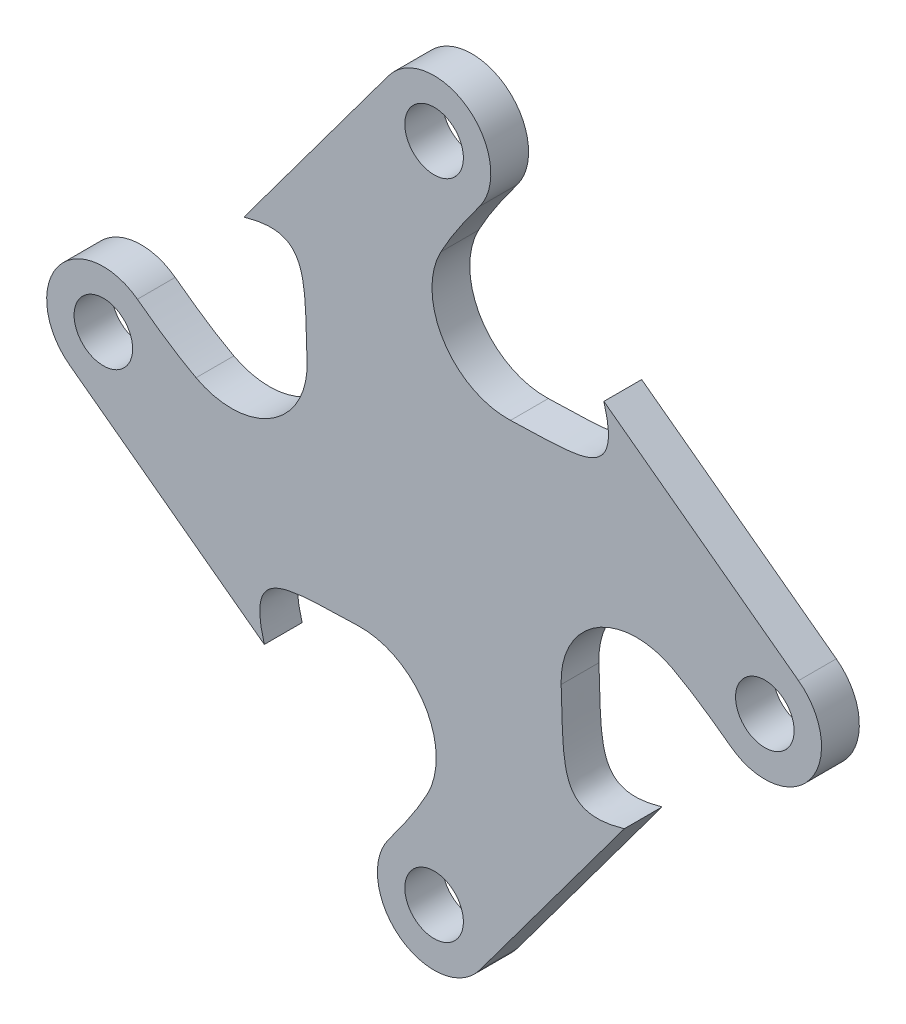
ISO-10303-21;
HEADER;
FILE_DESCRIPTION(('STEP AP214'),'2;1');
FILE_NAME('part.step','',(''),(''),'','','');
FILE_SCHEMA(('AUTOMOTIVE_DESIGN { 1 0 10303 214 1 1 1 1 }'));
ENDSEC;
DATA;
#1=APPLICATION_CONTEXT('core data for automotive mechanical design processes');
#2=APPLICATION_PROTOCOL_DEFINITION('international standard','automotive_design',2000,#1);
#3=PRODUCT_CONTEXT('',#1,'mechanical');
#4=PRODUCT('Part','Part','',(#3));
#5=PRODUCT_RELATED_PRODUCT_CATEGORY('part','',(#4));
#6=PRODUCT_DEFINITION_FORMATION('','',#4);
#7=PRODUCT_DEFINITION_CONTEXT('part definition',#1,'design');
#8=PRODUCT_DEFINITION('design','',#6,#7);
#9=PRODUCT_DEFINITION_SHAPE('','',#8);
#10=(LENGTH_UNIT() NAMED_UNIT(*) SI_UNIT(.MILLI.,.METRE.));
#11=(NAMED_UNIT(*) PLANE_ANGLE_UNIT() SI_UNIT($,.RADIAN.));
#12=(NAMED_UNIT(*) SI_UNIT($,.STERADIAN.) SOLID_ANGLE_UNIT());
#13=UNCERTAINTY_MEASURE_WITH_UNIT(LENGTH_MEASURE(1.E-05),#10,'distance_accuracy_value','');
#14=(GEOMETRIC_REPRESENTATION_CONTEXT(3) GLOBAL_UNCERTAINTY_ASSIGNED_CONTEXT((#13)) GLOBAL_UNIT_ASSIGNED_CONTEXT((#10,
#11,#12)) REPRESENTATION_CONTEXT('',''));
#15=CARTESIAN_POINT('',(0.,0.,0.));
#16=DIRECTION('',(0.,0.,1.));
#17=DIRECTION('',(1.,0.,0.));
#18=AXIS2_PLACEMENT_3D('',#15,#16,#17);
#19=CARTESIAN_POINT('',(-10.062410419015,8.98360382236813,2.));
#20=CARTESIAN_POINT('',(-4.76049822060656,10.5187773188604,2.));
#21=CARTESIAN_POINT('',(-8.17600939884948,4.4707680019017,2.));
#22=CARTESIAN_POINT('',(-5.59212995310449,-2.17441545882833,2.));
#23=B_SPLINE_CURVE_WITH_KNOTS('',3,(#19,#20,#21,#22),.UNSPECIFIED.,.F.,.F.,(4,4),(0.,1.),.UNSPECIFIED.);
#24=DIRECTION('',(0.,0.,-1.));
#25=VECTOR('',#24,1.);
#26=SURFACE_OF_LINEAR_EXTRUSION('',#23,#25);
#27=CARTESIAN_POINT('',(-10.062410419015,8.98360382236813,0.));
#28=CARTESIAN_POINT('',(-4.76049822060656,10.5187773188604,0.));
#29=CARTESIAN_POINT('',(-8.17600939884948,4.4707680019017,0.));
#30=CARTESIAN_POINT('',(-5.59212995310449,-2.17441545882833,0.));
#31=B_SPLINE_CURVE_WITH_KNOTS('',3,(#27,#28,#29,#30),.UNSPECIFIED.,.F.,.F.,(4,4),(0.,1.),.UNSPECIFIED.);
#32=CARTESIAN_POINT('',(-10.062410419015,8.98360382236813,0.));
#33=VERTEX_POINT('',#32);
#34=CARTESIAN_POINT('',(-6.72254395219128,4.04475251777847,0.));
#35=VERTEX_POINT('',#34);
#36=EDGE_CURVE('E392',#33,#35,#31,.T.);
#37=ORIENTED_EDGE('',*,*,#36,.T.);
#38=DIRECTION('',(0.,0.,-1.));
#39=VECTOR('',#38,1.);
#40=CARTESIAN_POINT('',(-6.72254395219186,4.04475251779317,0.));
#41=LINE('',#40,#39);
#42=CARTESIAN_POINT('',(-6.72254395219128,4.04475251777847,2.));
#43=VERTEX_POINT('',#42);
#44=EDGE_CURVE('E372',#35,#43,#41,.F.);
#45=ORIENTED_EDGE('',*,*,#44,.T.);
#46=CARTESIAN_POINT('',(-10.062410419015,8.98360382236813,2.));
#47=VERTEX_POINT('',#46);
#48=EDGE_CURVE('E301',#47,#43,#23,.T.);
#49=ORIENTED_EDGE('',*,*,#48,.F.);
#50=DIRECTION('',(0.,0.,-1.));
#51=VECTOR('',#50,1.);
#52=CARTESIAN_POINT('',(-10.062410419015,8.98360382236813,2.));
#53=LINE('',#52,#51);
#54=EDGE_CURVE('E377',#47,#33,#53,.T.);
#55=ORIENTED_EDGE('',*,*,#54,.T.);
#56=EDGE_LOOP('',(#37,#45,#49,#55));
#57=FACE_BOUND('',#56,.T.);
#58=ADVANCED_FACE('F35',(#57),#26,.F.);
#59=CARTESIAN_POINT('',(4.25702429147716,4.22820815260713,2.));
#60=CARTESIAN_POINT('',(0.108817481629295,8.40468587513948,2.));
#61=CARTESIAN_POINT('',(-2.96426942676939,8.54641605176527,2.));
#62=CARTESIAN_POINT('',(2.40014791806406,15.7001972409698,2.));
#63=B_SPLINE_CURVE_WITH_KNOTS('',3,(#59,#60,#61,#62),.UNSPECIFIED.,.F.,.F.,(4,4),(0.,1.),.UNSPECIFIED.);
#64=DIRECTION('',(0.,0.,-1.));
#65=VECTOR('',#64,1.);
#66=SURFACE_OF_LINEAR_EXTRUSION('',#63,#65);
#67=CARTESIAN_POINT('',(0.354438378044691,12.5956281870455,2.));
#68=VERTEX_POINT('',#67);
#69=CARTESIAN_POINT('',(2.40014791806406,15.7001972409698,2.));
#70=VERTEX_POINT('',#69);
#71=EDGE_CURVE('E307',#68,#70,#63,.T.);
#72=ORIENTED_EDGE('',*,*,#71,.F.);
#73=DIRECTION('',(0.,0.,-1.));
#74=VECTOR('',#73,1.);
#75=CARTESIAN_POINT('',(0.354438378043567,12.5956281870434,2.));
#76=LINE('',#75,#74);
#77=CARTESIAN_POINT('',(0.354438378044691,12.5956281870455,0.));
#78=VERTEX_POINT('',#77);
#79=EDGE_CURVE('E56',#68,#78,#76,.T.);
#80=ORIENTED_EDGE('',*,*,#79,.T.);
#81=CARTESIAN_POINT('',(4.25702429147716,4.22820815260713,0.));
#82=CARTESIAN_POINT('',(0.108817481629295,8.40468587513948,0.));
#83=CARTESIAN_POINT('',(-2.96426942676939,8.54641605176527,0.));
#84=CARTESIAN_POINT('',(2.40014791806406,15.7001972409698,0.));
#85=B_SPLINE_CURVE_WITH_KNOTS('',3,(#81,#82,#83,#84),.UNSPECIFIED.,.F.,.F.,(4,4),(0.,1.),.UNSPECIFIED.);
#86=CARTESIAN_POINT('',(2.40014791806406,15.7001972409698,0.));
#87=VERTEX_POINT('',#86);
#88=EDGE_CURVE('E388',#78,#87,#85,.T.);
#89=ORIENTED_EDGE('',*,*,#88,.T.);
#90=DIRECTION('',(0.,0.,-1.));
#91=VECTOR('',#90,1.);
#92=CARTESIAN_POINT('',(2.40014791806406,15.7001972409698,2.));
#93=LINE('',#92,#91);
#94=EDGE_CURVE('E380',#70,#87,#93,.T.);
#95=ORIENTED_EDGE('',*,*,#94,.F.);
#96=EDGE_LOOP('',(#72,#80,#89,#95));
#97=FACE_BOUND('',#96,.T.);
#98=ADVANCED_FACE('F319',(#97),#66,.F.);
#99=CARTESIAN_POINT('',(-10.7851413626872,8.01054160241209,2.));
#100=DIRECTION('',(0.802789371924031,-0.59626271418379,0.));
#101=DIRECTION('',(0.59626271418379,0.802789371924031,0.));
#102=AXIS2_PLACEMENT_3D('',#99,#100,#101);
#103=PLANE('',#102);
#104=DIRECTION('',(-0.59626271418379,-0.802789371924031,0.));
#105=VECTOR('',#104,1.);
#106=CARTESIAN_POINT('',(-10.7851413626872,8.01054160241209,0.));
#107=LINE('',#106,#105);
#108=CARTESIAN_POINT('',(-2.41369577454256,19.2815927446966,0.));
#109=VERTEX_POINT('',#108);
#110=EDGE_CURVE('E297',#109,#33,#107,.T.);
#111=ORIENTED_EDGE('',*,*,#110,.T.);
#112=ORIENTED_EDGE('',*,*,#54,.F.);
#113=DIRECTION('',(-0.59626271418379,-0.802789371924031,0.));
#114=VECTOR('',#113,1.);
#115=CARTESIAN_POINT('',(-10.7851413626872,8.01054160241209,2.));
#116=LINE('',#115,#114);
#117=CARTESIAN_POINT('',(-2.41369577454256,19.2815927446966,2.));
#118=VERTEX_POINT('',#117);
#119=EDGE_CURVE('E298',#118,#47,#116,.T.);
#120=ORIENTED_EDGE('',*,*,#119,.F.);
#121=DIRECTION('',(0.,0.,-1.));
#122=VECTOR('',#121,1.);
#123=CARTESIAN_POINT('',(-2.41369577454256,19.2815927446966,2.));
#124=LINE('',#123,#122);
#125=EDGE_CURVE('E383',#118,#109,#124,.T.);
#126=ORIENTED_EDGE('',*,*,#125,.T.);
#127=EDGE_LOOP('',(#111,#112,#120,#126));
#128=FACE_BOUND('',#127,.T.);
#129=ADVANCED_FACE('F322',(#128),#103,.F.);
#130=CARTESIAN_POINT('',(0.,17.5,2.));
#131=DIRECTION('',(0.,0.,-1.));
#132=DIRECTION('',(-1.,0.,0.));
#133=AXIS2_PLACEMENT_3D('',#130,#131,#132);
#134=CYLINDRICAL_SURFACE('',#133,3.);
#135=CARTESIAN_POINT('',(0.,17.5,0.));
#136=DIRECTION('',(0.,0.,1.));
#137=DIRECTION('',(1.,0.,0.));
#138=AXIS2_PLACEMENT_3D('',#135,#136,#137);
#139=CIRCLE('',#138,3.);
#140=EDGE_CURVE('E302',#87,#109,#139,.T.);
#141=ORIENTED_EDGE('',*,*,#140,.T.);
#142=ORIENTED_EDGE('',*,*,#125,.F.);
#143=CARTESIAN_POINT('',(0.,17.5,2.));
#144=DIRECTION('',(0.,0.,1.));
#145=DIRECTION('',(1.,0.,0.));
#146=AXIS2_PLACEMENT_3D('',#143,#144,#145);
#147=CIRCLE('',#146,3.);
#148=EDGE_CURVE('E386',#70,#118,#147,.T.);
#149=ORIENTED_EDGE('',*,*,#148,.F.);
#150=ORIENTED_EDGE('',*,*,#94,.T.);
#151=EDGE_LOOP('',(#141,#142,#149,#150));
#152=FACE_BOUND('',#151,.T.);
#153=ADVANCED_FACE('F325',(#152),#134,.T.);
#154=CARTESIAN_POINT('',(0.,0.,2.));
#155=DIRECTION('',(0.,0.,1.));
#156=DIRECTION('',(1.,0.,0.));
#157=AXIS2_PLACEMENT_3D('',#154,#155,#156);
#158=PLANE('',#157);
#159=CARTESIAN_POINT('',(-17.5,0.,2.));
#160=DIRECTION('',(0.,0.,1.));
#161=DIRECTION('',(1.,0.,0.));
#162=AXIS2_PLACEMENT_3D('',#159,#160,#161);
#163=CIRCLE('',#162,1.55);
#164=CARTESIAN_POINT('',(-15.95,0.,2.));
#165=VERTEX_POINT('',#164);
#166=EDGE_CURVE('E601',#165,#165,#163,.T.);
#167=ORIENTED_EDGE('',*,*,#166,.F.);
#168=EDGE_LOOP('',(#167));
#169=FACE_BOUND('',#168,.T.);
#170=CARTESIAN_POINT('',(0.,-17.5,2.));
#171=DIRECTION('',(0.,0.,1.));
#172=DIRECTION('',(1.,0.,0.));
#173=AXIS2_PLACEMENT_3D('',#170,#171,#172);
#174=CIRCLE('',#173,1.55);
#175=CARTESIAN_POINT('',(1.55,-17.5,2.));
#176=VERTEX_POINT('',#175);
#177=EDGE_CURVE('E603',#176,#176,#174,.T.);
#178=ORIENTED_EDGE('',*,*,#177,.F.);
#179=EDGE_LOOP('',(#178));
#180=FACE_BOUND('',#179,.T.);
#181=CARTESIAN_POINT('',(17.5,1.83302770289264E-13,2.));
#182=DIRECTION('',(0.,0.,1.));
#183=DIRECTION('',(1.,0.,0.));
#184=AXIS2_PLACEMENT_3D('',#181,#182,#183);
#185=CIRCLE('',#184,1.55);
#186=CARTESIAN_POINT('',(19.05,1.83302770289264E-13,2.));
#187=VERTEX_POINT('',#186);
#188=EDGE_CURVE('E609',#187,#187,#185,.T.);
#189=ORIENTED_EDGE('',*,*,#188,.F.);
#190=EDGE_LOOP('',(#189));
#191=FACE_BOUND('',#190,.T.);
#192=CARTESIAN_POINT('',(0.,17.5,2.));
#193=DIRECTION('',(0.,0.,1.));
#194=DIRECTION('',(1.,0.,0.));
#195=AXIS2_PLACEMENT_3D('',#192,#193,#194);
#196=CIRCLE('',#195,1.55);
#197=CARTESIAN_POINT('',(1.55,17.5,2.));
#198=VERTEX_POINT('',#197);
#199=EDGE_CURVE('E615',#198,#198,#196,.T.);
#200=ORIENTED_EDGE('',*,*,#199,.F.);
#201=EDGE_LOOP('',(#200));
#202=FACE_BOUND('',#201,.T.);
#203=ORIENTED_EDGE('',*,*,#48,.T.);
#204=CARTESIAN_POINT('',(-10.7194371215907,3.88712957398968,2.));
#205=DIRECTION('',(0.,0.,1.));
#206=DIRECTION('',(1.,0.,0.));
#207=AXIS2_PLACEMENT_3D('',#204,#205,#206);
#208=CIRCLE('',#207,4.);
#209=CARTESIAN_POINT('',(-12.595628187045,0.354438378044396,2.));
#210=VERTEX_POINT('',#209);
#211=EDGE_CURVE('E359',#43,#210,#208,.F.);
#212=ORIENTED_EDGE('',*,*,#211,.T.);
#213=CARTESIAN_POINT('',(-4.22820815260714,4.25702429147714,2.));
#214=CARTESIAN_POINT('',(-8.40468587513948,0.108817481629266,2.));
#215=CARTESIAN_POINT('',(-8.54641605176526,-2.96426942676942,2.));
#216=CARTESIAN_POINT('',(-15.7001972409698,2.40014791806401,2.));
#217=B_SPLINE_CURVE_WITH_KNOTS('',3,(#213,#214,#215,#216),.UNSPECIFIED.,.F.,.F.,(4,4),(0.,1.),.UNSPECIFIED.);
#218=CARTESIAN_POINT('',(-15.7001972409698,2.40014791806401,2.));
#219=VERTEX_POINT('',#218);
#220=EDGE_CURVE('E251',#210,#219,#217,.T.);
#221=ORIENTED_EDGE('',*,*,#220,.T.);
#222=CARTESIAN_POINT('',(-17.5,0.,2.));
#223=DIRECTION('',(0.,0.,1.));
#224=DIRECTION('',(0.,1.,0.));
#225=AXIS2_PLACEMENT_3D('',#222,#223,#224);
#226=CIRCLE('',#225,3.);
#227=CARTESIAN_POINT('',(-19.2815927446965,-2.41369577454262,2.));
#228=VERTEX_POINT('',#227);
#229=EDGE_CURVE('E256',#219,#228,#226,.T.);
#230=ORIENTED_EDGE('',*,*,#229,.T.);
#231=DIRECTION('',(0.802789371924033,-0.596262714183787,0.));
#232=VECTOR('',#231,1.);
#233=CARTESIAN_POINT('',(-8.01054160241205,-10.7851413626872,2.));
#234=LINE('',#233,#232);
#235=CARTESIAN_POINT('',(-8.98360382236809,-10.062410419015,2.));
#236=VERTEX_POINT('',#235);
#237=EDGE_CURVE('E288',#228,#236,#234,.T.);
#238=ORIENTED_EDGE('',*,*,#237,.T.);
#239=CARTESIAN_POINT('',(-8.98360382236809,-10.062410419015,2.));
#240=CARTESIAN_POINT('',(-10.5187773188604,-4.76049822060659,2.));
#241=CARTESIAN_POINT('',(-4.47076800190167,-8.1760093988495,2.));
#242=CARTESIAN_POINT('',(2.17441545882835,-5.59212995310448,2.));
#243=B_SPLINE_CURVE_WITH_KNOTS('',3,(#239,#240,#241,#242),.UNSPECIFIED.,.F.,.F.,(4,4),(0.,1.),.UNSPECIFIED.);
#244=CARTESIAN_POINT('',(-4.04475251777852,-6.7225439521913,2.));
#245=VERTEX_POINT('',#244);
#246=EDGE_CURVE('E257',#236,#245,#243,.T.);
#247=ORIENTED_EDGE('',*,*,#246,.T.);
#248=CARTESIAN_POINT('',(-3.88712957398973,-10.7194371215907,2.));
#249=DIRECTION('',(0.,0.,1.));
#250=DIRECTION('',(1.,0.,0.));
#251=AXIS2_PLACEMENT_3D('',#248,#249,#250);
#252=CIRCLE('',#251,4.);
#253=CARTESIAN_POINT('',(-0.354438378044873,-12.5956281870458,2.));
#254=VERTEX_POINT('',#253);
#255=EDGE_CURVE('E353',#245,#254,#252,.F.);
#256=ORIENTED_EDGE('',*,*,#255,.T.);
#257=CARTESIAN_POINT('',(-4.25702429147716,-4.22820815260713,2.));
#258=CARTESIAN_POINT('',(-0.108817481629295,-8.40468587513948,2.));
#259=CARTESIAN_POINT('',(2.96426942676939,-8.54641605176527,2.));
#260=CARTESIAN_POINT('',(-2.40014791806406,-15.7001972409698,2.));
#261=B_SPLINE_CURVE_WITH_KNOTS('',3,(#257,#258,#259,#260),.UNSPECIFIED.,.F.,.F.,(4,4),(0.,1.),.UNSPECIFIED.);
#262=CARTESIAN_POINT('',(-2.40014791806406,-15.7001972409698,2.));
#263=VERTEX_POINT('',#262);
#264=EDGE_CURVE('E216',#254,#263,#261,.T.);
#265=ORIENTED_EDGE('',*,*,#264,.T.);
#266=CARTESIAN_POINT('',(0.,-17.5,2.));
#267=DIRECTION('',(0.,0.,1.));
#268=DIRECTION('',(-1.,0.,0.));
#269=AXIS2_PLACEMENT_3D('',#266,#267,#268);
#270=CIRCLE('',#269,3.);
#271=CARTESIAN_POINT('',(2.41369577454256,-19.2815927446966,2.));
#272=VERTEX_POINT('',#271);
#273=EDGE_CURVE('E437',#263,#272,#270,.T.);
#274=ORIENTED_EDGE('',*,*,#273,.T.);
#275=DIRECTION('',(0.59626271418379,0.802789371924031,0.));
#276=VECTOR('',#275,1.);
#277=CARTESIAN_POINT('',(10.7851413626872,-8.01054160241209,2.));
#278=LINE('',#277,#276);
#279=CARTESIAN_POINT('',(10.062410419015,-8.98360382236813,2.));
#280=VERTEX_POINT('',#279);
#281=EDGE_CURVE('E206',#272,#280,#278,.T.);
#282=ORIENTED_EDGE('',*,*,#281,.T.);
#283=CARTESIAN_POINT('',(10.062410419015,-8.98360382236813,2.));
#284=CARTESIAN_POINT('',(4.76049822060656,-10.5187773188604,2.));
#285=CARTESIAN_POINT('',(8.17600939884948,-4.4707680019017,2.));
#286=CARTESIAN_POINT('',(5.59212995310449,2.17441545882833,2.));
#287=B_SPLINE_CURVE_WITH_KNOTS('',3,(#283,#284,#285,#286),.UNSPECIFIED.,.F.,.F.,(4,4),(0.,1.),.UNSPECIFIED.);
#288=CARTESIAN_POINT('',(6.72254395219128,-4.04475251777838,2.));
#289=VERTEX_POINT('',#288);
#290=EDGE_CURVE('E209',#280,#289,#287,.T.);
#291=ORIENTED_EDGE('',*,*,#290,.T.);
#292=CARTESIAN_POINT('',(10.7194371215906,-3.88712957398958,2.));
#293=DIRECTION('',(0.,0.,1.));
#294=DIRECTION('',(1.,0.,0.));
#295=AXIS2_PLACEMENT_3D('',#292,#293,#294);
#296=CIRCLE('',#295,4.);
#297=CARTESIAN_POINT('',(12.595628187045,-0.354438378044284,2.));
#298=VERTEX_POINT('',#297);
#299=EDGE_CURVE('E346',#289,#298,#296,.F.);
#300=ORIENTED_EDGE('',*,*,#299,.T.);
#301=CARTESIAN_POINT('',(4.22820815260717,-4.25702429147711,2.));
#302=CARTESIAN_POINT('',(8.40468587513948,-0.108817481629207,2.));
#303=CARTESIAN_POINT('',(8.54641605176524,2.96426942676948,2.));
#304=CARTESIAN_POINT('',(15.7001972409698,-2.4001479180639,2.));
#305=B_SPLINE_CURVE_WITH_KNOTS('',3,(#301,#302,#303,#304),.UNSPECIFIED.,.F.,.F.,(4,4),(0.,1.),.UNSPECIFIED.);
#306=CARTESIAN_POINT('',(15.7001972409698,-2.4001479180639,2.));
#307=VERTEX_POINT('',#306);
#308=EDGE_CURVE('E179',#298,#307,#305,.T.);
#309=ORIENTED_EDGE('',*,*,#308,.T.);
#310=CARTESIAN_POINT('',(17.5,1.83302770289264E-13,2.));
#311=DIRECTION('',(0.,0.,1.));
#312=DIRECTION('',(0.,-1.,0.));
#313=AXIS2_PLACEMENT_3D('',#310,#311,#312);
#314=CIRCLE('',#313,3.);
#315=CARTESIAN_POINT('',(19.2815927446965,2.41369577454276,2.));
#316=VERTEX_POINT('',#315);
#317=EDGE_CURVE('E186',#307,#316,#314,.T.);
#318=ORIENTED_EDGE('',*,*,#317,.T.);
#319=DIRECTION('',(-0.802789371924038,0.596262714183781,0.));
#320=VECTOR('',#319,1.);
#321=CARTESIAN_POINT('',(8.01054160241197,10.7851413626873,2.));
#322=LINE('',#321,#320);
#323=CARTESIAN_POINT('',(8.98360382236802,10.0624104190151,2.));
#324=VERTEX_POINT('',#323);
#325=EDGE_CURVE('E180',#316,#324,#322,.T.);
#326=ORIENTED_EDGE('',*,*,#325,.T.);
#327=CARTESIAN_POINT('',(8.98360382236802,10.0624104190151,2.));
#328=CARTESIAN_POINT('',(10.5187773188603,4.76049822060667,2.));
#329=CARTESIAN_POINT('',(4.47076800190161,8.17600939884953,2.));
#330=CARTESIAN_POINT('',(-2.17441545882839,5.59212995310446,2.));
#331=B_SPLINE_CURVE_WITH_KNOTS('',3,(#327,#328,#329,#330),.UNSPECIFIED.,.F.,.F.,(4,4),(0.,1.),.UNSPECIFIED.);
#332=CARTESIAN_POINT('',(4.04475251777856,6.72254395219133,2.));
#333=VERTEX_POINT('',#332);
#334=EDGE_CURVE('E170',#324,#333,#331,.T.);
#335=ORIENTED_EDGE('',*,*,#334,.T.);
#336=CARTESIAN_POINT('',(3.88712957398974,10.7194371215907,2.));
#337=DIRECTION('',(0.,0.,1.));
#338=DIRECTION('',(1.,0.,0.));
#339=AXIS2_PLACEMENT_3D('',#336,#337,#338);
#340=CIRCLE('',#339,4.);
#341=EDGE_CURVE('E43',#333,#68,#340,.F.);
#342=ORIENTED_EDGE('',*,*,#341,.T.);
#343=ORIENTED_EDGE('',*,*,#71,.T.);
#344=ORIENTED_EDGE('',*,*,#148,.T.);
#345=ORIENTED_EDGE('',*,*,#119,.T.);
#346=EDGE_LOOP('',(#203,#212,#221,#230,#238,#247,#256,#265,#274,#282,#291,#300,#309,#318,#326,
#335,#342,#343,#344,#345));
#347=FACE_BOUND('',#346,.T.);
#348=ADVANCED_FACE('F184',(#169,#180,#191,#202,#347),#158,.T.);
#349=CARTESIAN_POINT('',(0.,0.,0.));
#350=DIRECTION('',(0.,0.,1.));
#351=DIRECTION('',(1.,0.,0.));
#352=AXIS2_PLACEMENT_3D('',#349,#350,#351);
#353=PLANE('',#352);
#354=CARTESIAN_POINT('',(-17.5,0.,0.));
#355=DIRECTION('',(0.,0.,1.));
#356=DIRECTION('',(1.,0.,0.));
#357=AXIS2_PLACEMENT_3D('',#354,#355,#356);
#358=CIRCLE('',#357,1.55);
#359=CARTESIAN_POINT('',(-15.95,0.,0.));
#360=VERTEX_POINT('',#359);
#361=EDGE_CURVE('E598',#360,#360,#358,.T.);
#362=ORIENTED_EDGE('',*,*,#361,.T.);
#363=EDGE_LOOP('',(#362));
#364=FACE_BOUND('',#363,.T.);
#365=CARTESIAN_POINT('',(0.,-17.5,0.));
#366=DIRECTION('',(0.,0.,1.));
#367=DIRECTION('',(1.,0.,0.));
#368=AXIS2_PLACEMENT_3D('',#365,#366,#367);
#369=CIRCLE('',#368,1.55);
#370=CARTESIAN_POINT('',(1.55,-17.5,0.));
#371=VERTEX_POINT('',#370);
#372=EDGE_CURVE('E606',#371,#371,#369,.T.);
#373=ORIENTED_EDGE('',*,*,#372,.T.);
#374=EDGE_LOOP('',(#373));
#375=FACE_BOUND('',#374,.T.);
#376=CARTESIAN_POINT('',(17.5,1.83302770289264E-13,0.));
#377=DIRECTION('',(0.,0.,1.));
#378=DIRECTION('',(1.,0.,0.));
#379=AXIS2_PLACEMENT_3D('',#376,#377,#378);
#380=CIRCLE('',#379,1.55);
#381=CARTESIAN_POINT('',(19.05,1.83302770289264E-13,0.));
#382=VERTEX_POINT('',#381);
#383=EDGE_CURVE('E612',#382,#382,#380,.T.);
#384=ORIENTED_EDGE('',*,*,#383,.T.);
#385=EDGE_LOOP('',(#384));
#386=FACE_BOUND('',#385,.T.);
#387=CARTESIAN_POINT('',(0.,17.5,0.));
#388=DIRECTION('',(0.,0.,1.));
#389=DIRECTION('',(1.,0.,0.));
#390=AXIS2_PLACEMENT_3D('',#387,#388,#389);
#391=CIRCLE('',#390,1.55);
#392=CARTESIAN_POINT('',(1.55,17.5,0.));
#393=VERTEX_POINT('',#392);
#394=EDGE_CURVE('E618',#393,#393,#391,.T.);
#395=ORIENTED_EDGE('',*,*,#394,.T.);
#396=EDGE_LOOP('',(#395));
#397=FACE_BOUND('',#396,.T.);
#398=CARTESIAN_POINT('',(-4.22820815260714,4.25702429147714,0.));
#399=CARTESIAN_POINT('',(-8.40468587513948,0.108817481629266,0.));
#400=CARTESIAN_POINT('',(-8.54641605176526,-2.96426942676942,0.));
#401=CARTESIAN_POINT('',(-15.7001972409698,2.40014791806401,0.));
#402=B_SPLINE_CURVE_WITH_KNOTS('',3,(#398,#399,#400,#401),.UNSPECIFIED.,.F.,.F.,(4,4),(0.,1.),.UNSPECIFIED.);
#403=CARTESIAN_POINT('',(-12.595628187045,0.354438378044396,0.));
#404=VERTEX_POINT('',#403);
#405=CARTESIAN_POINT('',(-15.7001972409698,2.40014791806401,0.));
#406=VERTEX_POINT('',#405);
#407=EDGE_CURVE('E276',#404,#406,#402,.T.);
#408=ORIENTED_EDGE('',*,*,#407,.F.);
#409=CARTESIAN_POINT('',(-10.7194371215907,3.88712957398968,0.));
#410=DIRECTION('',(0.,0.,1.));
#411=DIRECTION('',(1.,0.,0.));
#412=AXIS2_PLACEMENT_3D('',#409,#410,#411);
#413=CIRCLE('',#412,4.);
#414=EDGE_CURVE('E361',#404,#35,#413,.T.);
#415=ORIENTED_EDGE('',*,*,#414,.T.);
#416=ORIENTED_EDGE('',*,*,#36,.F.);
#417=ORIENTED_EDGE('',*,*,#110,.F.);
#418=ORIENTED_EDGE('',*,*,#140,.F.);
#419=ORIENTED_EDGE('',*,*,#88,.F.);
#420=CARTESIAN_POINT('',(3.88712957398974,10.7194371215907,0.));
#421=DIRECTION('',(0.,0.,1.));
#422=DIRECTION('',(1.,0.,0.));
#423=AXIS2_PLACEMENT_3D('',#420,#421,#422);
#424=CIRCLE('',#423,4.);
#425=CARTESIAN_POINT('',(4.04475251777856,6.72254395219133,0.));
#426=VERTEX_POINT('',#425);
#427=EDGE_CURVE('E11',#78,#426,#424,.T.);
#428=ORIENTED_EDGE('',*,*,#427,.T.);
#429=CARTESIAN_POINT('',(8.98360382236802,10.0624104190151,0.));
#430=CARTESIAN_POINT('',(10.5187773188603,4.76049822060667,0.));
#431=CARTESIAN_POINT('',(4.47076800190161,8.17600939884953,0.));
#432=CARTESIAN_POINT('',(-2.17441545882839,5.59212995310446,0.));
#433=B_SPLINE_CURVE_WITH_KNOTS('',3,(#429,#430,#431,#432),.UNSPECIFIED.,.F.,.F.,(4,4),(0.,1.),.UNSPECIFIED.);
#434=CARTESIAN_POINT('',(8.98360382236802,10.0624104190151,0.));
#435=VERTEX_POINT('',#434);
#436=EDGE_CURVE('E627',#435,#426,#433,.T.);
#437=ORIENTED_EDGE('',*,*,#436,.F.);
#438=DIRECTION('',(-0.802789371924038,0.596262714183781,0.));
#439=VECTOR('',#438,1.);
#440=CARTESIAN_POINT('',(8.01054160241197,10.7851413626873,0.));
#441=LINE('',#440,#439);
#442=CARTESIAN_POINT('',(19.2815927446965,2.41369577454276,0.));
#443=VERTEX_POINT('',#442);
#444=EDGE_CURVE('E194',#443,#435,#441,.T.);
#445=ORIENTED_EDGE('',*,*,#444,.F.);
#446=CARTESIAN_POINT('',(17.5,1.83302770289264E-13,0.));
#447=DIRECTION('',(0.,0.,1.));
#448=DIRECTION('',(0.,-1.,0.));
#449=AXIS2_PLACEMENT_3D('',#446,#447,#448);
#450=CIRCLE('',#449,3.);
#451=CARTESIAN_POINT('',(15.7001972409698,-2.4001479180639,0.));
#452=VERTEX_POINT('',#451);
#453=EDGE_CURVE('E190',#452,#443,#450,.T.);
#454=ORIENTED_EDGE('',*,*,#453,.F.);
#455=CARTESIAN_POINT('',(4.22820815260717,-4.25702429147711,0.));
#456=CARTESIAN_POINT('',(8.40468587513948,-0.108817481629207,0.));
#457=CARTESIAN_POINT('',(8.54641605176524,2.96426942676948,0.));
#458=CARTESIAN_POINT('',(15.7001972409698,-2.4001479180639,0.));
#459=B_SPLINE_CURVE_WITH_KNOTS('',3,(#455,#456,#457,#458),.UNSPECIFIED.,.F.,.F.,(4,4),(0.,1.),.UNSPECIFIED.);
#460=CARTESIAN_POINT('',(12.595628187045,-0.354438378044284,0.));
#461=VERTEX_POINT('',#460);
#462=EDGE_CURVE('E467',#461,#452,#459,.T.);
#463=ORIENTED_EDGE('',*,*,#462,.F.);
#464=CARTESIAN_POINT('',(10.7194371215906,-3.88712957398958,0.));
#465=DIRECTION('',(0.,0.,1.));
#466=DIRECTION('',(1.,0.,0.));
#467=AXIS2_PLACEMENT_3D('',#464,#465,#466);
#468=CIRCLE('',#467,4.);
#469=CARTESIAN_POINT('',(6.72254395219128,-4.04475251777838,0.));
#470=VERTEX_POINT('',#469);
#471=EDGE_CURVE('E351',#461,#470,#468,.T.);
#472=ORIENTED_EDGE('',*,*,#471,.T.);
#473=CARTESIAN_POINT('',(10.062410419015,-8.98360382236813,0.));
#474=CARTESIAN_POINT('',(4.76049822060656,-10.5187773188604,0.));
#475=CARTESIAN_POINT('',(8.17600939884948,-4.4707680019017,0.));
#476=CARTESIAN_POINT('',(5.59212995310449,2.17441545882833,0.));
#477=B_SPLINE_CURVE_WITH_KNOTS('',3,(#473,#474,#475,#476),.UNSPECIFIED.,.F.,.F.,(4,4),(0.,1.),.UNSPECIFIED.);
#478=CARTESIAN_POINT('',(10.062410419015,-8.98360382236813,0.));
#479=VERTEX_POINT('',#478);
#480=EDGE_CURVE('E199',#479,#470,#477,.T.);
#481=ORIENTED_EDGE('',*,*,#480,.F.);
#482=DIRECTION('',(0.59626271418379,0.802789371924031,0.));
#483=VECTOR('',#482,1.);
#484=CARTESIAN_POINT('',(10.7851413626872,-8.01054160241209,0.));
#485=LINE('',#484,#483);
#486=CARTESIAN_POINT('',(2.41369577454256,-19.2815927446966,0.));
#487=VERTEX_POINT('',#486);
#488=EDGE_CURVE('E195',#487,#479,#485,.T.);
#489=ORIENTED_EDGE('',*,*,#488,.F.);
#490=CARTESIAN_POINT('',(0.,-17.5,0.));
#491=DIRECTION('',(0.,0.,1.));
#492=DIRECTION('',(-1.,0.,0.));
#493=AXIS2_PLACEMENT_3D('',#490,#491,#492);
#494=CIRCLE('',#493,3.);
#495=CARTESIAN_POINT('',(-2.40014791806406,-15.7001972409698,0.));
#496=VERTEX_POINT('',#495);
#497=EDGE_CURVE('E210',#496,#487,#494,.T.);
#498=ORIENTED_EDGE('',*,*,#497,.F.);
#499=CARTESIAN_POINT('',(-4.25702429147716,-4.22820815260713,0.));
#500=CARTESIAN_POINT('',(-0.108817481629295,-8.40468587513948,0.));
#501=CARTESIAN_POINT('',(2.96426942676939,-8.54641605176527,0.));
#502=CARTESIAN_POINT('',(-2.40014791806406,-15.7001972409698,0.));
#503=B_SPLINE_CURVE_WITH_KNOTS('',3,(#499,#500,#501,#502),.UNSPECIFIED.,.F.,.F.,(4,4),(0.,1.),.UNSPECIFIED.);
#504=CARTESIAN_POINT('',(-0.354438378044873,-12.5956281870458,0.));
#505=VERTEX_POINT('',#504);
#506=EDGE_CURVE('E439',#505,#496,#503,.T.);
#507=ORIENTED_EDGE('',*,*,#506,.F.);
#508=CARTESIAN_POINT('',(-3.88712957398973,-10.7194371215907,0.));
#509=DIRECTION('',(0.,0.,1.));
#510=DIRECTION('',(1.,0.,0.));
#511=AXIS2_PLACEMENT_3D('',#508,#509,#510);
#512=CIRCLE('',#511,4.);
#513=CARTESIAN_POINT('',(-4.04475251777852,-6.7225439521913,0.));
#514=VERTEX_POINT('',#513);
#515=EDGE_CURVE('E357',#505,#514,#512,.T.);
#516=ORIENTED_EDGE('',*,*,#515,.T.);
#517=CARTESIAN_POINT('',(-8.98360382236809,-10.062410419015,0.));
#518=CARTESIAN_POINT('',(-10.5187773188604,-4.76049822060659,0.));
#519=CARTESIAN_POINT('',(-4.47076800190167,-8.1760093988495,0.));
#520=CARTESIAN_POINT('',(2.17441545882835,-5.59212995310448,0.));
#521=B_SPLINE_CURVE_WITH_KNOTS('',3,(#517,#518,#519,#520),.UNSPECIFIED.,.F.,.F.,(4,4),(0.,1.),.UNSPECIFIED.);
#522=CARTESIAN_POINT('',(-8.98360382236809,-10.062410419015,0.));
#523=VERTEX_POINT('',#522);
#524=EDGE_CURVE('E270',#523,#514,#521,.T.);
#525=ORIENTED_EDGE('',*,*,#524,.F.);
#526=DIRECTION('',(0.802789371924033,-0.596262714183787,0.));
#527=VECTOR('',#526,1.);
#528=CARTESIAN_POINT('',(-8.01054160241205,-10.7851413626872,0.));
#529=LINE('',#528,#527);
#530=CARTESIAN_POINT('',(-19.2815927446965,-2.41369577454262,0.));
#531=VERTEX_POINT('',#530);
#532=EDGE_CURVE('E267',#531,#523,#529,.T.);
#533=ORIENTED_EDGE('',*,*,#532,.F.);
#534=CARTESIAN_POINT('',(-17.5,0.,0.));
#535=DIRECTION('',(0.,0.,1.));
#536=DIRECTION('',(0.,1.,0.));
#537=AXIS2_PLACEMENT_3D('',#534,#535,#536);
#538=CIRCLE('',#537,3.);
#539=EDGE_CURVE('E283',#406,#531,#538,.T.);
#540=ORIENTED_EDGE('',*,*,#539,.F.);
#541=EDGE_LOOP('',(#408,#415,#416,#417,#418,#419,#428,#437,#445,#454,#463,#472,#481,#489,#498,
#507,#516,#525,#533,#540));
#542=FACE_BOUND('',#541,.T.);
#543=ADVANCED_FACE('F246',(#364,#375,#386,#397,#542),#353,.F.);
#544=DIRECTION('',(0.,0.,-1.));
#545=VECTOR('',#544,1.);
#546=SURFACE_OF_LINEAR_EXTRUSION('',#217,#545);
#547=ORIENTED_EDGE('',*,*,#220,.F.);
#548=DIRECTION('',(0.,0.,-1.));
#549=VECTOR('',#548,1.);
#550=CARTESIAN_POINT('',(-12.5956281870433,0.354438378043476,2.));
#551=LINE('',#550,#549);
#552=EDGE_CURVE('E374',#210,#404,#551,.T.);
#553=ORIENTED_EDGE('',*,*,#552,.T.);
#554=ORIENTED_EDGE('',*,*,#407,.T.);
#555=DIRECTION('',(0.,0.,-1.));
#556=VECTOR('',#555,1.);
#557=CARTESIAN_POINT('',(-15.7001972409698,2.40014791806401,2.));
#558=LINE('',#557,#556);
#559=EDGE_CURVE('E291',#219,#406,#558,.T.);
#560=ORIENTED_EDGE('',*,*,#559,.F.);
#561=EDGE_LOOP('',(#547,#553,#554,#560));
#562=FACE_BOUND('',#561,.T.);
#563=ADVANCED_FACE('F242',(#562),#546,.F.);
#564=DIRECTION('',(0.,0.,-1.));
#565=VECTOR('',#564,1.);
#566=SURFACE_OF_LINEAR_EXTRUSION('',#331,#565);
#567=ORIENTED_EDGE('',*,*,#436,.T.);
#568=DIRECTION('',(0.,0.,-1.));
#569=VECTOR('',#568,1.);
#570=CARTESIAN_POINT('',(4.04475251779327,6.72254395219191,0.));
#571=LINE('',#570,#569);
#572=EDGE_CURVE('E178',#426,#333,#571,.F.);
#573=ORIENTED_EDGE('',*,*,#572,.T.);
#574=ORIENTED_EDGE('',*,*,#334,.F.);
#575=DIRECTION('',(0.,0.,-1.));
#576=VECTOR('',#575,1.);
#577=CARTESIAN_POINT('',(8.98360382236802,10.0624104190151,2.));
#578=LINE('',#577,#576);
#579=EDGE_CURVE('E175',#324,#435,#578,.T.);
#580=ORIENTED_EDGE('',*,*,#579,.T.);
#581=EDGE_LOOP('',(#567,#573,#574,#580));
#582=FACE_BOUND('',#581,.T.);
#583=ADVANCED_FACE('F173',(#582),#566,.F.);
#584=DIRECTION('',(0.,0.,-1.));
#585=VECTOR('',#584,1.);
#586=SURFACE_OF_LINEAR_EXTRUSION('',#243,#585);
#587=ORIENTED_EDGE('',*,*,#524,.T.);
#588=DIRECTION('',(0.,0.,-1.));
#589=VECTOR('',#588,1.);
#590=CARTESIAN_POINT('',(-4.04475251779323,-6.72254395219187,0.));
#591=LINE('',#590,#589);
#592=EDGE_CURVE('E367',#514,#245,#591,.F.);
#593=ORIENTED_EDGE('',*,*,#592,.T.);
#594=ORIENTED_EDGE('',*,*,#246,.F.);
#595=DIRECTION('',(0.,0.,-1.));
#596=VECTOR('',#595,1.);
#597=CARTESIAN_POINT('',(-8.98360382236809,-10.062410419015,2.));
#598=LINE('',#597,#596);
#599=EDGE_CURVE('E294',#236,#523,#598,.T.);
#600=ORIENTED_EDGE('',*,*,#599,.T.);
#601=EDGE_LOOP('',(#587,#593,#594,#600));
#602=FACE_BOUND('',#601,.T.);
#603=ADVANCED_FACE('F248',(#602),#586,.F.);
#604=CARTESIAN_POINT('',(-8.01054160241205,-10.7851413626872,2.));
#605=DIRECTION('',(0.596262714183787,0.802789371924033,0.));
#606=DIRECTION('',(-0.802789371924034,0.596262714183787,0.));
#607=AXIS2_PLACEMENT_3D('',#604,#605,#606);
#608=PLANE('',#607);
#609=ORIENTED_EDGE('',*,*,#532,.T.);
#610=ORIENTED_EDGE('',*,*,#599,.F.);
#611=ORIENTED_EDGE('',*,*,#237,.F.);
#612=DIRECTION('',(0.,0.,-1.));
#613=VECTOR('',#612,1.);
#614=CARTESIAN_POINT('',(-19.2815927446965,-2.41369577454262,2.));
#615=LINE('',#614,#613);
#616=EDGE_CURVE('E266',#228,#531,#615,.T.);
#617=ORIENTED_EDGE('',*,*,#616,.T.);
#618=EDGE_LOOP('',(#609,#610,#611,#617));
#619=FACE_BOUND('',#618,.T.);
#620=ADVANCED_FACE('F240',(#619),#608,.F.);
#621=CARTESIAN_POINT('',(-17.5,0.,2.));
#622=DIRECTION('',(0.,0.,-1.));
#623=DIRECTION('',(-1.,0.,0.));
#624=AXIS2_PLACEMENT_3D('',#621,#622,#623);
#625=CYLINDRICAL_SURFACE('',#624,3.);
#626=ORIENTED_EDGE('',*,*,#539,.T.);
#627=ORIENTED_EDGE('',*,*,#616,.F.);
#628=ORIENTED_EDGE('',*,*,#229,.F.);
#629=ORIENTED_EDGE('',*,*,#559,.T.);
#630=EDGE_LOOP('',(#626,#627,#628,#629));
#631=FACE_BOUND('',#630,.T.);
#632=ADVANCED_FACE('F237',(#631),#625,.T.);
#633=DIRECTION('',(0.,0.,-1.));
#634=VECTOR('',#633,1.);
#635=SURFACE_OF_LINEAR_EXTRUSION('',#261,#634);
#636=ORIENTED_EDGE('',*,*,#264,.F.);
#637=DIRECTION('',(0.,0.,-1.));
#638=VECTOR('',#637,1.);
#639=CARTESIAN_POINT('',(-0.354438378043952,-12.5956281870441,2.));
#640=LINE('',#639,#638);
#641=EDGE_CURVE('E369',#254,#505,#640,.T.);
#642=ORIENTED_EDGE('',*,*,#641,.T.);
#643=ORIENTED_EDGE('',*,*,#506,.T.);
#644=DIRECTION('',(0.,0.,-1.));
#645=VECTOR('',#644,1.);
#646=CARTESIAN_POINT('',(-2.40014791806406,-15.7001972409698,2.));
#647=LINE('',#646,#645);
#648=EDGE_CURVE('E431',#263,#496,#647,.T.);
#649=ORIENTED_EDGE('',*,*,#648,.F.);
#650=EDGE_LOOP('',(#636,#642,#643,#649));
#651=FACE_BOUND('',#650,.T.);
#652=ADVANCED_FACE('F230',(#651),#635,.F.);
#653=DIRECTION('',(0.,0.,-1.));
#654=VECTOR('',#653,1.);
#655=SURFACE_OF_LINEAR_EXTRUSION('',#287,#654);
#656=ORIENTED_EDGE('',*,*,#480,.T.);
#657=DIRECTION('',(0.,0.,-1.));
#658=VECTOR('',#657,1.);
#659=CARTESIAN_POINT('',(6.72254395219186,-4.04475251779309,0.));
#660=LINE('',#659,#658);
#661=EDGE_CURVE('E347',#470,#289,#660,.F.);
#662=ORIENTED_EDGE('',*,*,#661,.T.);
#663=ORIENTED_EDGE('',*,*,#290,.F.);
#664=DIRECTION('',(0.,0.,-1.));
#665=VECTOR('',#664,1.);
#666=CARTESIAN_POINT('',(10.062410419015,-8.98360382236813,2.));
#667=LINE('',#666,#665);
#668=EDGE_CURVE('E271',#280,#479,#667,.T.);
#669=ORIENTED_EDGE('',*,*,#668,.T.);
#670=EDGE_LOOP('',(#656,#662,#663,#669));
#671=FACE_BOUND('',#670,.T.);
#672=ADVANCED_FACE('F225',(#671),#655,.F.);
#673=CARTESIAN_POINT('',(10.7851413626872,-8.01054160241209,2.));
#674=DIRECTION('',(-0.802789371924031,0.59626271418379,0.));
#675=DIRECTION('',(-0.59626271418379,-0.802789371924031,0.));
#676=AXIS2_PLACEMENT_3D('',#673,#674,#675);
#677=PLANE('',#676);
#678=ORIENTED_EDGE('',*,*,#488,.T.);
#679=ORIENTED_EDGE('',*,*,#668,.F.);
#680=ORIENTED_EDGE('',*,*,#281,.F.);
#681=DIRECTION('',(0.,0.,-1.));
#682=VECTOR('',#681,1.);
#683=CARTESIAN_POINT('',(2.41369577454256,-19.2815927446966,2.));
#684=LINE('',#683,#682);
#685=EDGE_CURVE('E434',#272,#487,#684,.T.);
#686=ORIENTED_EDGE('',*,*,#685,.T.);
#687=EDGE_LOOP('',(#678,#679,#680,#686));
#688=FACE_BOUND('',#687,.T.);
#689=ADVANCED_FACE('F229',(#688),#677,.F.);
#690=CARTESIAN_POINT('',(0.,-17.5,2.));
#691=DIRECTION('',(0.,0.,-1.));
#692=DIRECTION('',(-1.,0.,0.));
#693=AXIS2_PLACEMENT_3D('',#690,#691,#692);
#694=CYLINDRICAL_SURFACE('',#693,3.);
#695=ORIENTED_EDGE('',*,*,#497,.T.);
#696=ORIENTED_EDGE('',*,*,#685,.F.);
#697=ORIENTED_EDGE('',*,*,#273,.F.);
#698=ORIENTED_EDGE('',*,*,#648,.T.);
#699=EDGE_LOOP('',(#695,#696,#697,#698));
#700=FACE_BOUND('',#699,.T.);
#701=ADVANCED_FACE('F235',(#700),#694,.T.);
#702=DIRECTION('',(0.,0.,-1.));
#703=VECTOR('',#702,1.);
#704=SURFACE_OF_LINEAR_EXTRUSION('',#305,#703);
#705=ORIENTED_EDGE('',*,*,#308,.F.);
#706=DIRECTION('',(0.,0.,-1.));
#707=VECTOR('',#706,1.);
#708=CARTESIAN_POINT('',(12.5956281870432,-0.354438378043365,2.));
#709=LINE('',#708,#707);
#710=EDGE_CURVE('E349',#298,#461,#709,.T.);
#711=ORIENTED_EDGE('',*,*,#710,.T.);
#712=ORIENTED_EDGE('',*,*,#462,.T.);
#713=DIRECTION('',(0.,0.,-1.));
#714=VECTOR('',#713,1.);
#715=CARTESIAN_POINT('',(15.7001972409698,-2.4001479180639,2.));
#716=LINE('',#715,#714);
#717=EDGE_CURVE('E196',#307,#452,#716,.T.);
#718=ORIENTED_EDGE('',*,*,#717,.F.);
#719=EDGE_LOOP('',(#705,#711,#712,#718));
#720=FACE_BOUND('',#719,.T.);
#721=ADVANCED_FACE('F469',(#720),#704,.F.);
#722=CARTESIAN_POINT('',(8.01054160241197,10.7851413626873,2.));
#723=DIRECTION('',(-0.596262714183781,-0.802789371924038,0.));
#724=DIRECTION('',(0.802789371924038,-0.596262714183781,0.));
#725=AXIS2_PLACEMENT_3D('',#722,#723,#724);
#726=PLANE('',#725);
#727=ORIENTED_EDGE('',*,*,#444,.T.);
#728=ORIENTED_EDGE('',*,*,#579,.F.);
#729=ORIENTED_EDGE('',*,*,#325,.F.);
#730=DIRECTION('',(0.,0.,-1.));
#731=VECTOR('',#730,1.);
#732=CARTESIAN_POINT('',(19.2815927446965,2.41369577454276,2.));
#733=LINE('',#732,#731);
#734=EDGE_CURVE('E202',#316,#443,#733,.T.);
#735=ORIENTED_EDGE('',*,*,#734,.T.);
#736=EDGE_LOOP('',(#727,#728,#729,#735));
#737=FACE_BOUND('',#736,.T.);
#738=ADVANCED_FACE('F192',(#737),#726,.F.);
#739=CARTESIAN_POINT('',(17.5,1.83302770289264E-13,2.));
#740=DIRECTION('',(0.,0.,-1.));
#741=DIRECTION('',(-1.,0.,0.));
#742=AXIS2_PLACEMENT_3D('',#739,#740,#741);
#743=CYLINDRICAL_SURFACE('',#742,3.);
#744=ORIENTED_EDGE('',*,*,#453,.T.);
#745=ORIENTED_EDGE('',*,*,#734,.F.);
#746=ORIENTED_EDGE('',*,*,#317,.F.);
#747=ORIENTED_EDGE('',*,*,#717,.T.);
#748=EDGE_LOOP('',(#744,#745,#746,#747));
#749=FACE_BOUND('',#748,.T.);
#750=ADVANCED_FACE('F331',(#749),#743,.T.);
#751=CARTESIAN_POINT('',(-10.7194371215907,3.88712957398968,2.));
#752=DIRECTION('',(0.,0.,-1.));
#753=DIRECTION('',(-1.,0.,0.));
#754=AXIS2_PLACEMENT_3D('',#751,#752,#753);
#755=CYLINDRICAL_SURFACE('',#754,4.);
#756=ORIENTED_EDGE('',*,*,#211,.F.);
#757=ORIENTED_EDGE('',*,*,#44,.F.);
#758=ORIENTED_EDGE('',*,*,#414,.F.);
#759=ORIENTED_EDGE('',*,*,#552,.F.);
#760=EDGE_LOOP('',(#756,#757,#758,#759));
#761=FACE_BOUND('',#760,.T.);
#762=ADVANCED_FACE('F327',(#761),#755,.F.);
#763=CARTESIAN_POINT('',(-3.88712957398973,-10.7194371215907,2.));
#764=DIRECTION('',(0.,0.,-1.));
#765=DIRECTION('',(-1.,0.,0.));
#766=AXIS2_PLACEMENT_3D('',#763,#764,#765);
#767=CYLINDRICAL_SURFACE('',#766,4.);
#768=ORIENTED_EDGE('',*,*,#255,.F.);
#769=ORIENTED_EDGE('',*,*,#592,.F.);
#770=ORIENTED_EDGE('',*,*,#515,.F.);
#771=ORIENTED_EDGE('',*,*,#641,.F.);
#772=EDGE_LOOP('',(#768,#769,#770,#771));
#773=FACE_BOUND('',#772,.T.);
#774=ADVANCED_FACE('F330',(#773),#767,.F.);
#775=CARTESIAN_POINT('',(10.7194371215906,-3.88712957398958,2.));
#776=DIRECTION('',(0.,0.,-1.));
#777=DIRECTION('',(-1.,0.,0.));
#778=AXIS2_PLACEMENT_3D('',#775,#776,#777);
#779=CYLINDRICAL_SURFACE('',#778,4.);
#780=ORIENTED_EDGE('',*,*,#299,.F.);
#781=ORIENTED_EDGE('',*,*,#661,.F.);
#782=ORIENTED_EDGE('',*,*,#471,.F.);
#783=ORIENTED_EDGE('',*,*,#710,.F.);
#784=EDGE_LOOP('',(#780,#781,#782,#783));
#785=FACE_BOUND('',#784,.T.);
#786=ADVANCED_FACE('F334',(#785),#779,.F.);
#787=CARTESIAN_POINT('',(3.88712957398974,10.7194371215907,0.));
#788=DIRECTION('',(0.,0.,-1.));
#789=DIRECTION('',(-1.,0.,0.));
#790=AXIS2_PLACEMENT_3D('',#787,#788,#789);
#791=CYLINDRICAL_SURFACE('',#790,4.);
#792=ORIENTED_EDGE('',*,*,#427,.F.);
#793=ORIENTED_EDGE('',*,*,#79,.F.);
#794=ORIENTED_EDGE('',*,*,#341,.F.);
#795=ORIENTED_EDGE('',*,*,#572,.F.);
#796=EDGE_LOOP('',(#792,#793,#794,#795));
#797=FACE_BOUND('',#796,.T.);
#798=ADVANCED_FACE('F37',(#797),#791,.F.);
#799=CARTESIAN_POINT('',(0.,17.5,0.));
#800=DIRECTION('',(0.,0.,1.));
#801=DIRECTION('',(1.,0.,0.));
#802=AXIS2_PLACEMENT_3D('',#799,#800,#801);
#803=CYLINDRICAL_SURFACE('',#802,1.55);
#804=ORIENTED_EDGE('',*,*,#394,.F.);
#805=EDGE_LOOP('',(#804));
#806=FACE_BOUND('',#805,.T.);
#807=ORIENTED_EDGE('',*,*,#199,.T.);
#808=EDGE_LOOP('',(#807));
#809=FACE_BOUND('',#808,.T.);
#810=ADVANCED_FACE('F341',(#806,#809),#803,.F.);
#811=CARTESIAN_POINT('',(17.5,1.83302770289264E-13,0.));
#812=DIRECTION('',(0.,0.,1.));
#813=DIRECTION('',(1.,0.,0.));
#814=AXIS2_PLACEMENT_3D('',#811,#812,#813);
#815=CYLINDRICAL_SURFACE('',#814,1.55);
#816=ORIENTED_EDGE('',*,*,#383,.F.);
#817=EDGE_LOOP('',(#816));
#818=FACE_BOUND('',#817,.T.);
#819=ORIENTED_EDGE('',*,*,#188,.T.);
#820=EDGE_LOOP('',(#819));
#821=FACE_BOUND('',#820,.T.);
#822=ADVANCED_FACE('F562',(#818,#821),#815,.F.);
#823=CARTESIAN_POINT('',(0.,-17.5,0.));
#824=DIRECTION('',(0.,0.,1.));
#825=DIRECTION('',(1.,0.,0.));
#826=AXIS2_PLACEMENT_3D('',#823,#824,#825);
#827=CYLINDRICAL_SURFACE('',#826,1.55);
#828=ORIENTED_EDGE('',*,*,#372,.F.);
#829=EDGE_LOOP('',(#828));
#830=FACE_BOUND('',#829,.T.);
#831=ORIENTED_EDGE('',*,*,#177,.T.);
#832=EDGE_LOOP('',(#831));
#833=FACE_BOUND('',#832,.T.);
#834=ADVANCED_FACE('F571',(#830,#833),#827,.F.);
#835=CARTESIAN_POINT('',(-17.5,0.,0.));
#836=DIRECTION('',(0.,0.,1.));
#837=DIRECTION('',(1.,0.,0.));
#838=AXIS2_PLACEMENT_3D('',#835,#836,#837);
#839=CYLINDRICAL_SURFACE('',#838,1.55);
#840=ORIENTED_EDGE('',*,*,#361,.F.);
#841=EDGE_LOOP('',(#840));
#842=FACE_BOUND('',#841,.T.);
#843=ORIENTED_EDGE('',*,*,#166,.T.);
#844=EDGE_LOOP('',(#843));
#845=FACE_BOUND('',#844,.T.);
#846=ADVANCED_FACE('F581',(#842,#845),#839,.F.);
#847=CLOSED_SHELL('',(#58,#98,#129,#153,#348,#543,#563,#583,#603,#620,#632,#652,#672,#689,#701,
#721,#738,#750,#762,#774,#786,#798,#810,#822,#834,#846));
#848=MANIFOLD_SOLID_BREP('B2',#847);
#849=ADVANCED_BREP_SHAPE_REPRESENTATION('',(#18,#848),#14);
#850=SHAPE_DEFINITION_REPRESENTATION(#9,#849);
ENDSEC;
END-ISO-10303-21;
